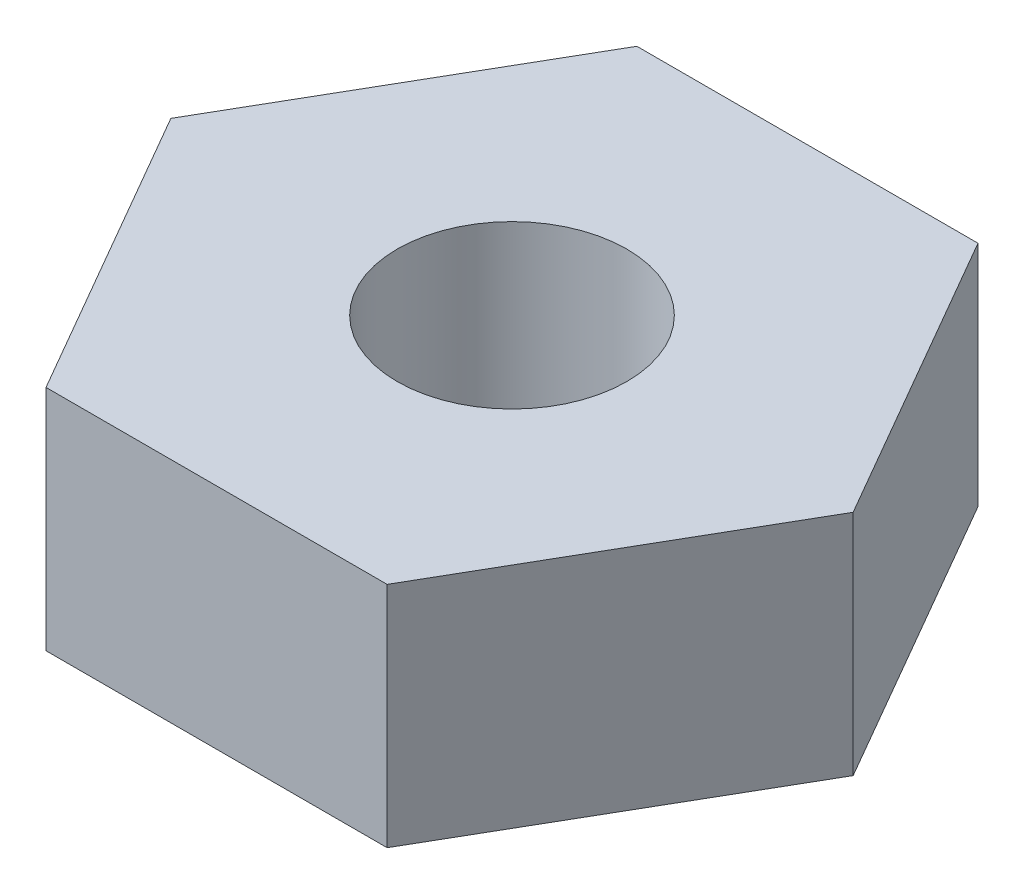
ISO-10303-21;
HEADER;
FILE_DESCRIPTION(('STEP AP214'),'2;1');
FILE_NAME('part.step','',(''),(''),'','','');
FILE_SCHEMA(('AUTOMOTIVE_DESIGN { 1 0 10303 214 1 1 1 1 }'));
ENDSEC;
DATA;
#1=APPLICATION_CONTEXT('core data for automotive mechanical design processes');
#2=APPLICATION_PROTOCOL_DEFINITION('international standard','automotive_design',2000,#1);
#3=PRODUCT_CONTEXT('',#1,'mechanical');
#4=PRODUCT('Part','Part','',(#3));
#5=PRODUCT_RELATED_PRODUCT_CATEGORY('part','',(#4));
#6=PRODUCT_DEFINITION_FORMATION('','',#4);
#7=PRODUCT_DEFINITION_CONTEXT('part definition',#1,'design');
#8=PRODUCT_DEFINITION('design','',#6,#7);
#9=PRODUCT_DEFINITION_SHAPE('','',#8);
#10=(LENGTH_UNIT() NAMED_UNIT(*) SI_UNIT(.MILLI.,.METRE.));
#11=(NAMED_UNIT(*) PLANE_ANGLE_UNIT() SI_UNIT($,.RADIAN.));
#12=(NAMED_UNIT(*) SI_UNIT($,.STERADIAN.) SOLID_ANGLE_UNIT());
#13=UNCERTAINTY_MEASURE_WITH_UNIT(LENGTH_MEASURE(1.E-05),#10,'distance_accuracy_value','');
#14=(GEOMETRIC_REPRESENTATION_CONTEXT(3) GLOBAL_UNCERTAINTY_ASSIGNED_CONTEXT((#13)) GLOBAL_UNIT_ASSIGNED_CONTEXT((#10,
#11,#12)) REPRESENTATION_CONTEXT('',''));
#15=CARTESIAN_POINT('',(0.,0.,0.));
#16=DIRECTION('',(0.,0.,1.));
#17=DIRECTION('',(1.,0.,0.));
#18=AXIS2_PLACEMENT_3D('',#15,#16,#17);
#19=CARTESIAN_POINT('',(0.,1.49,0.));
#20=DIRECTION('',(0.,1.,0.));
#21=DIRECTION('',(0.,0.,1.));
#22=AXIS2_PLACEMENT_3D('',#19,#20,#21);
#23=PLANE('',#22);
#24=DIRECTION('',(0.499999999999995,0.,-0.866025403784442));
#25=VECTOR('',#24,1.);
#26=CARTESIAN_POINT('',(1.114286019536,1.49,1.92999999999999));
#27=LINE('',#26,#25);
#28=CARTESIAN_POINT('',(1.114286019536,1.49,1.92999999999999));
#29=VERTEX_POINT('',#28);
#30=CARTESIAN_POINT('',(2.22857203907196,1.49,0.));
#31=VERTEX_POINT('',#30);
#32=EDGE_CURVE('E146',#29,#31,#27,.T.);
#33=ORIENTED_EDGE('',*,*,#32,.T.);
#34=DIRECTION('',(-0.500000000000001,0.,-0.866025403784438));
#35=VECTOR('',#34,1.);
#36=CARTESIAN_POINT('',(2.22857203907196,1.49,0.));
#37=LINE('',#36,#35);
#38=CARTESIAN_POINT('',(1.11428601953597,1.49,-1.93));
#39=VERTEX_POINT('',#38);
#40=EDGE_CURVE('E94',#31,#39,#37,.T.);
#41=ORIENTED_EDGE('',*,*,#40,.T.);
#42=DIRECTION('',(-1.,0.,0.));
#43=VECTOR('',#42,1.);
#44=CARTESIAN_POINT('',(1.11428601953597,1.49,-1.93));
#45=LINE('',#44,#43);
#46=CARTESIAN_POINT('',(-1.11428601953599,1.49,-1.93));
#47=VERTEX_POINT('',#46);
#48=EDGE_CURVE('E107',#39,#47,#45,.T.);
#49=ORIENTED_EDGE('',*,*,#48,.T.);
#50=DIRECTION('',(-0.499999999999995,0.,0.866025403784442));
#51=VECTOR('',#50,1.);
#52=CARTESIAN_POINT('',(-1.11428601953599,1.49,-1.93));
#53=LINE('',#52,#51);
#54=CARTESIAN_POINT('',(-2.22857203907196,1.49,0.));
#55=VERTEX_POINT('',#54);
#56=EDGE_CURVE('E101',#47,#55,#53,.T.);
#57=ORIENTED_EDGE('',*,*,#56,.T.);
#58=DIRECTION('',(0.500000000000007,0.,0.866025403784435));
#59=VECTOR('',#58,1.);
#60=CARTESIAN_POINT('',(-2.22857203907196,1.49,0.));
#61=LINE('',#60,#59);
#62=CARTESIAN_POINT('',(-1.11428601953596,1.49,1.93000000000001));
#63=VERTEX_POINT('',#62);
#64=EDGE_CURVE('E105',#55,#63,#61,.T.);
#65=ORIENTED_EDGE('',*,*,#64,.T.);
#66=DIRECTION('',(1.,0.,0.));
#67=VECTOR('',#66,1.);
#68=CARTESIAN_POINT('',(-1.11428601953596,1.49,1.93000000000001));
#69=LINE('',#68,#67);
#70=EDGE_CURVE('E57',#63,#29,#69,.T.);
#71=ORIENTED_EDGE('',*,*,#70,.T.);
#72=EDGE_LOOP('',(#33,#41,#49,#57,#65,#71));
#73=FACE_BOUND('',#72,.T.);
#74=CARTESIAN_POINT('',(0.,1.49,0.));
#75=DIRECTION('',(0.,1.,0.));
#76=DIRECTION('',(0.,0.,1.));
#77=AXIS2_PLACEMENT_3D('',#74,#75,#76);
#78=CIRCLE('',#77,0.75);
#79=CARTESIAN_POINT('',(0.,1.49,0.75));
#80=VERTEX_POINT('',#79);
#81=EDGE_CURVE('E134',#80,#80,#78,.T.);
#82=ORIENTED_EDGE('',*,*,#81,.F.);
#83=EDGE_LOOP('',(#82));
#84=FACE_BOUND('',#83,.T.);
#85=ADVANCED_FACE('F39',(#73,#84),#23,.T.);
#86=CARTESIAN_POINT('',(0.,0.,0.));
#87=DIRECTION('',(0.,1.,0.));
#88=DIRECTION('',(0.,0.,1.));
#89=AXIS2_PLACEMENT_3D('',#86,#87,#88);
#90=PLANE('',#89);
#91=DIRECTION('',(0.499999999999995,0.,-0.866025403784442));
#92=VECTOR('',#91,1.);
#93=CARTESIAN_POINT('',(1.114286019536,0.,1.92999999999999));
#94=LINE('',#93,#92);
#95=CARTESIAN_POINT('',(1.114286019536,0.,1.92999999999999));
#96=VERTEX_POINT('',#95);
#97=CARTESIAN_POINT('',(2.22857203907196,0.,0.));
#98=VERTEX_POINT('',#97);
#99=EDGE_CURVE('E129',#96,#98,#94,.T.);
#100=ORIENTED_EDGE('',*,*,#99,.F.);
#101=DIRECTION('',(1.,0.,0.));
#102=VECTOR('',#101,1.);
#103=CARTESIAN_POINT('',(-1.11428601953596,0.,1.93000000000001));
#104=LINE('',#103,#102);
#105=CARTESIAN_POINT('',(-1.11428601953596,0.,1.93000000000001));
#106=VERTEX_POINT('',#105);
#107=EDGE_CURVE('E86',#106,#96,#104,.T.);
#108=ORIENTED_EDGE('',*,*,#107,.F.);
#109=DIRECTION('',(0.500000000000007,0.,0.866025403784435));
#110=VECTOR('',#109,1.);
#111=CARTESIAN_POINT('',(-2.22857203907196,0.,0.));
#112=LINE('',#111,#110);
#113=CARTESIAN_POINT('',(-2.22857203907196,0.,0.));
#114=VERTEX_POINT('',#113);
#115=EDGE_CURVE('E80',#114,#106,#112,.T.);
#116=ORIENTED_EDGE('',*,*,#115,.F.);
#117=DIRECTION('',(-0.499999999999995,0.,0.866025403784442));
#118=VECTOR('',#117,1.);
#119=CARTESIAN_POINT('',(-1.11428601953599,0.,-1.93));
#120=LINE('',#119,#118);
#121=CARTESIAN_POINT('',(-1.11428601953599,0.,-1.93));
#122=VERTEX_POINT('',#121);
#123=EDGE_CURVE('E116',#122,#114,#120,.T.);
#124=ORIENTED_EDGE('',*,*,#123,.F.);
#125=DIRECTION('',(-1.,0.,0.));
#126=VECTOR('',#125,1.);
#127=CARTESIAN_POINT('',(1.11428601953597,0.,-1.93));
#128=LINE('',#127,#126);
#129=CARTESIAN_POINT('',(1.11428601953597,0.,-1.93));
#130=VERTEX_POINT('',#129);
#131=EDGE_CURVE('E137',#130,#122,#128,.T.);
#132=ORIENTED_EDGE('',*,*,#131,.F.);
#133=DIRECTION('',(-0.500000000000001,0.,-0.866025403784438));
#134=VECTOR('',#133,1.);
#135=CARTESIAN_POINT('',(2.22857203907196,0.,0.));
#136=LINE('',#135,#134);
#137=EDGE_CURVE('E133',#98,#130,#136,.T.);
#138=ORIENTED_EDGE('',*,*,#137,.F.);
#139=EDGE_LOOP('',(#100,#108,#116,#124,#132,#138));
#140=FACE_BOUND('',#139,.T.);
#141=CARTESIAN_POINT('',(0.,0.,0.));
#142=DIRECTION('',(0.,1.,0.));
#143=DIRECTION('',(0.,0.,1.));
#144=AXIS2_PLACEMENT_3D('',#141,#142,#143);
#145=CIRCLE('',#144,0.75);
#146=CARTESIAN_POINT('',(0.,0.,0.75));
#147=VERTEX_POINT('',#146);
#148=EDGE_CURVE('E243',#147,#147,#145,.T.);
#149=ORIENTED_EDGE('',*,*,#148,.T.);
#150=EDGE_LOOP('',(#149));
#151=FACE_BOUND('',#150,.T.);
#152=ADVANCED_FACE('F159',(#140,#151),#90,.F.);
#153=CARTESIAN_POINT('',(1.114286019536,1.49,1.92999999999999));
#154=DIRECTION('',(-0.866025403784442,0.,-0.499999999999995));
#155=DIRECTION('',(-0.499999999999995,0.,0.866025403784442));
#156=AXIS2_PLACEMENT_3D('',#153,#154,#155);
#157=PLANE('',#156);
#158=ORIENTED_EDGE('',*,*,#99,.T.);
#159=DIRECTION('',(0.,-1.,0.));
#160=VECTOR('',#159,1.);
#161=CARTESIAN_POINT('',(2.22857203907196,1.49,0.));
#162=LINE('',#161,#160);
#163=EDGE_CURVE('E11',#31,#98,#162,.T.);
#164=ORIENTED_EDGE('',*,*,#163,.F.);
#165=ORIENTED_EDGE('',*,*,#32,.F.);
#166=DIRECTION('',(0.,-1.,0.));
#167=VECTOR('',#166,1.);
#168=CARTESIAN_POINT('',(1.114286019536,1.49,1.92999999999999));
#169=LINE('',#168,#167);
#170=EDGE_CURVE('E125',#29,#96,#169,.T.);
#171=ORIENTED_EDGE('',*,*,#170,.T.);
#172=EDGE_LOOP('',(#158,#164,#165,#171));
#173=FACE_BOUND('',#172,.T.);
#174=ADVANCED_FACE('F41',(#173),#157,.F.);
#175=CARTESIAN_POINT('',(2.22857203907196,1.49,0.));
#176=DIRECTION('',(-0.866025403784438,0.,0.500000000000001));
#177=DIRECTION('',(0.500000000000001,0.,0.866025403784438));
#178=AXIS2_PLACEMENT_3D('',#175,#176,#177);
#179=PLANE('',#178);
#180=ORIENTED_EDGE('',*,*,#137,.T.);
#181=DIRECTION('',(0.,-1.,0.));
#182=VECTOR('',#181,1.);
#183=CARTESIAN_POINT('',(1.11428601953597,1.49,-1.93));
#184=LINE('',#183,#182);
#185=EDGE_CURVE('E49',#39,#130,#184,.T.);
#186=ORIENTED_EDGE('',*,*,#185,.F.);
#187=ORIENTED_EDGE('',*,*,#40,.F.);
#188=ORIENTED_EDGE('',*,*,#163,.T.);
#189=EDGE_LOOP('',(#180,#186,#187,#188));
#190=FACE_BOUND('',#189,.T.);
#191=ADVANCED_FACE('F184',(#190),#179,.F.);
#192=CARTESIAN_POINT('',(1.11428601953597,1.49,-1.93));
#193=DIRECTION('',(0.,0.,1.));
#194=DIRECTION('',(1.,0.,0.));
#195=AXIS2_PLACEMENT_3D('',#192,#193,#194);
#196=PLANE('',#195);
#197=ORIENTED_EDGE('',*,*,#131,.T.);
#198=DIRECTION('',(0.,-1.,0.));
#199=VECTOR('',#198,1.);
#200=CARTESIAN_POINT('',(-1.11428601953599,1.49,-1.93));
#201=LINE('',#200,#199);
#202=EDGE_CURVE('E118',#47,#122,#201,.T.);
#203=ORIENTED_EDGE('',*,*,#202,.F.);
#204=ORIENTED_EDGE('',*,*,#48,.F.);
#205=ORIENTED_EDGE('',*,*,#185,.T.);
#206=EDGE_LOOP('',(#197,#203,#204,#205));
#207=FACE_BOUND('',#206,.T.);
#208=ADVANCED_FACE('F156',(#207),#196,.F.);
#209=CARTESIAN_POINT('',(-1.11428601953599,1.49,-1.93));
#210=DIRECTION('',(0.866025403784442,0.,0.499999999999995));
#211=DIRECTION('',(0.499999999999995,0.,-0.866025403784442));
#212=AXIS2_PLACEMENT_3D('',#209,#210,#211);
#213=PLANE('',#212);
#214=ORIENTED_EDGE('',*,*,#123,.T.);
#215=DIRECTION('',(0.,-1.,0.));
#216=VECTOR('',#215,1.);
#217=CARTESIAN_POINT('',(-2.22857203907196,1.49,0.));
#218=LINE('',#217,#216);
#219=EDGE_CURVE('E113',#55,#114,#218,.T.);
#220=ORIENTED_EDGE('',*,*,#219,.F.);
#221=ORIENTED_EDGE('',*,*,#56,.F.);
#222=ORIENTED_EDGE('',*,*,#202,.T.);
#223=EDGE_LOOP('',(#214,#220,#221,#222));
#224=FACE_BOUND('',#223,.T.);
#225=ADVANCED_FACE('F114',(#224),#213,.F.);
#226=CARTESIAN_POINT('',(-2.22857203907196,1.49,0.));
#227=DIRECTION('',(0.866025403784435,0.,-0.500000000000007));
#228=DIRECTION('',(-0.500000000000007,0.,-0.866025403784435));
#229=AXIS2_PLACEMENT_3D('',#226,#227,#228);
#230=PLANE('',#229);
#231=ORIENTED_EDGE('',*,*,#115,.T.);
#232=DIRECTION('',(0.,-1.,0.));
#233=VECTOR('',#232,1.);
#234=CARTESIAN_POINT('',(-1.11428601953596,1.49,1.93000000000001));
#235=LINE('',#234,#233);
#236=EDGE_CURVE('E119',#63,#106,#235,.T.);
#237=ORIENTED_EDGE('',*,*,#236,.F.);
#238=ORIENTED_EDGE('',*,*,#64,.F.);
#239=ORIENTED_EDGE('',*,*,#219,.T.);
#240=EDGE_LOOP('',(#231,#237,#238,#239));
#241=FACE_BOUND('',#240,.T.);
#242=ADVANCED_FACE('F121',(#241),#230,.F.);
#243=CARTESIAN_POINT('',(-1.11428601953596,1.49,1.93000000000001));
#244=DIRECTION('',(0.,0.,-1.));
#245=DIRECTION('',(-1.,0.,0.));
#246=AXIS2_PLACEMENT_3D('',#243,#244,#245);
#247=PLANE('',#246);
#248=ORIENTED_EDGE('',*,*,#107,.T.);
#249=ORIENTED_EDGE('',*,*,#170,.F.);
#250=ORIENTED_EDGE('',*,*,#70,.F.);
#251=ORIENTED_EDGE('',*,*,#236,.T.);
#252=EDGE_LOOP('',(#248,#249,#250,#251));
#253=FACE_BOUND('',#252,.T.);
#254=ADVANCED_FACE('F164',(#253),#247,.F.);
#255=CARTESIAN_POINT('',(0.,1.49,0.));
#256=DIRECTION('',(0.,-1.,0.));
#257=DIRECTION('',(0.,0.,-1.));
#258=AXIS2_PLACEMENT_3D('',#255,#256,#257);
#259=CYLINDRICAL_SURFACE('',#258,0.75);
#260=ORIENTED_EDGE('',*,*,#81,.T.);
#261=EDGE_LOOP('',(#260));
#262=FACE_BOUND('',#261,.T.);
#263=ORIENTED_EDGE('',*,*,#148,.F.);
#264=EDGE_LOOP('',(#263));
#265=FACE_BOUND('',#264,.T.);
#266=ADVANCED_FACE('F166',(#262,#265),#259,.F.);
#267=CLOSED_SHELL('',(#85,#152,#174,#191,#208,#225,#242,#254,#266));
#268=MANIFOLD_SOLID_BREP('B2',#267);
#269=ADVANCED_BREP_SHAPE_REPRESENTATION('',(#18,#268),#14);
#270=SHAPE_DEFINITION_REPRESENTATION(#9,#269);
ENDSEC;
END-ISO-10303-21;
